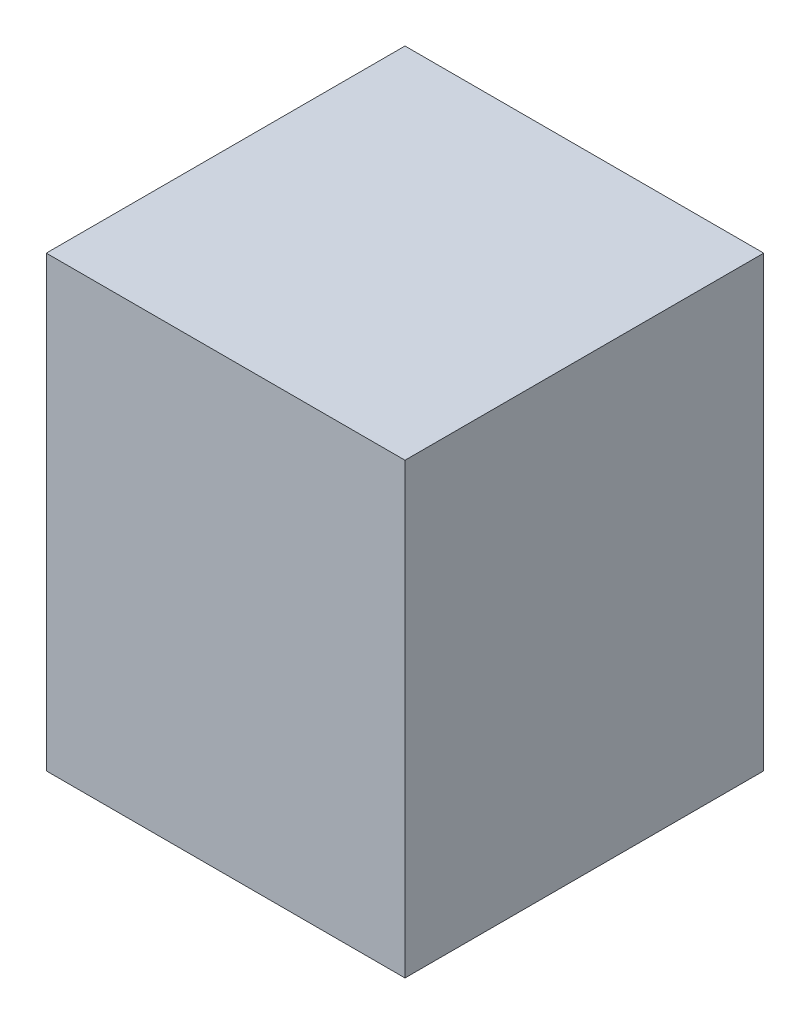
ISO-10303-21;
HEADER;
FILE_DESCRIPTION(('STEP AP214'),'2;1');
FILE_NAME('part.step','',(''),(''),'','','');
FILE_SCHEMA(('AUTOMOTIVE_DESIGN { 1 0 10303 214 1 1 1 1 }'));
ENDSEC;
DATA;
#1=APPLICATION_CONTEXT('core data for automotive mechanical design processes');
#2=APPLICATION_PROTOCOL_DEFINITION('international standard','automotive_design',2000,#1);
#3=PRODUCT_CONTEXT('',#1,'mechanical');
#4=PRODUCT('Part','Part','',(#3));
#5=PRODUCT_RELATED_PRODUCT_CATEGORY('part','',(#4));
#6=PRODUCT_DEFINITION_FORMATION('','',#4);
#7=PRODUCT_DEFINITION_CONTEXT('part definition',#1,'design');
#8=PRODUCT_DEFINITION('design','',#6,#7);
#9=PRODUCT_DEFINITION_SHAPE('','',#8);
#10=(LENGTH_UNIT() NAMED_UNIT(*) SI_UNIT(.MILLI.,.METRE.));
#11=(NAMED_UNIT(*) PLANE_ANGLE_UNIT() SI_UNIT($,.RADIAN.));
#12=(NAMED_UNIT(*) SI_UNIT($,.STERADIAN.) SOLID_ANGLE_UNIT());
#13=UNCERTAINTY_MEASURE_WITH_UNIT(LENGTH_MEASURE(1.E-05),#10,'distance_accuracy_value','');
#14=(GEOMETRIC_REPRESENTATION_CONTEXT(3) GLOBAL_UNCERTAINTY_ASSIGNED_CONTEXT((#13)) GLOBAL_UNIT_ASSIGNED_CONTEXT((#10,
#11,#12)) REPRESENTATION_CONTEXT('',''));
#15=CARTESIAN_POINT('',(0.,0.,0.));
#16=DIRECTION('',(0.,0.,1.));
#17=DIRECTION('',(1.,0.,0.));
#18=AXIS2_PLACEMENT_3D('',#15,#16,#17);
#19=CARTESIAN_POINT('',(0.,100.,0.));
#20=DIRECTION('',(1.,0.,0.));
#21=DIRECTION('',(0.,0.,-1.));
#22=AXIS2_PLACEMENT_3D('',#19,#20,#21);
#23=PLANE('',#22);
#24=DIRECTION('',(0.,0.,1.));
#25=VECTOR('',#24,1.);
#26=CARTESIAN_POINT('',(0.,0.,0.));
#27=LINE('',#26,#25);
#28=CARTESIAN_POINT('',(0.,0.,-80.));
#29=VERTEX_POINT('',#28);
#30=CARTESIAN_POINT('',(0.,0.,0.));
#31=VERTEX_POINT('',#30);
#32=EDGE_CURVE('E95',#29,#31,#27,.T.);
#33=ORIENTED_EDGE('',*,*,#32,.T.);
#34=DIRECTION('',(0.,-1.,0.));
#35=VECTOR('',#34,1.);
#36=CARTESIAN_POINT('',(0.,100.,0.));
#37=LINE('',#36,#35);
#38=CARTESIAN_POINT('',(0.,100.,0.));
#39=VERTEX_POINT('',#38);
#40=EDGE_CURVE('E11',#39,#31,#37,.T.);
#41=ORIENTED_EDGE('',*,*,#40,.F.);
#42=DIRECTION('',(0.,0.,1.));
#43=VECTOR('',#42,1.);
#44=CARTESIAN_POINT('',(0.,100.,0.));
#45=LINE('',#44,#43);
#46=CARTESIAN_POINT('',(0.,100.,-80.));
#47=VERTEX_POINT('',#46);
#48=EDGE_CURVE('E83',#47,#39,#45,.T.);
#49=ORIENTED_EDGE('',*,*,#48,.F.);
#50=DIRECTION('',(0.,-1.,0.));
#51=VECTOR('',#50,1.);
#52=CARTESIAN_POINT('',(0.,100.,-80.));
#53=LINE('',#52,#51);
#54=EDGE_CURVE('E91',#47,#29,#53,.T.);
#55=ORIENTED_EDGE('',*,*,#54,.T.);
#56=EDGE_LOOP('',(#33,#41,#49,#55));
#57=FACE_BOUND('',#56,.T.);
#58=ADVANCED_FACE('F32',(#57),#23,.F.);
#59=CARTESIAN_POINT('',(0.,100.,0.));
#60=DIRECTION('',(0.,0.,-1.));
#61=DIRECTION('',(-1.,0.,0.));
#62=AXIS2_PLACEMENT_3D('',#59,#60,#61);
#63=PLANE('',#62);
#64=DIRECTION('',(1.,0.,0.));
#65=VECTOR('',#64,1.);
#66=CARTESIAN_POINT('',(0.,0.,0.));
#67=LINE('',#66,#65);
#68=CARTESIAN_POINT('',(80.,0.,0.));
#69=VERTEX_POINT('',#68);
#70=EDGE_CURVE('E87',#31,#69,#67,.T.);
#71=ORIENTED_EDGE('',*,*,#70,.T.);
#72=DIRECTION('',(0.,-1.,0.));
#73=VECTOR('',#72,1.);
#74=CARTESIAN_POINT('',(80.,100.,0.));
#75=LINE('',#74,#73);
#76=CARTESIAN_POINT('',(80.,100.,0.));
#77=VERTEX_POINT('',#76);
#78=EDGE_CURVE('E40',#77,#69,#75,.T.);
#79=ORIENTED_EDGE('',*,*,#78,.F.);
#80=DIRECTION('',(1.,0.,0.));
#81=VECTOR('',#80,1.);
#82=CARTESIAN_POINT('',(0.,100.,0.));
#83=LINE('',#82,#81);
#84=EDGE_CURVE('E78',#39,#77,#83,.T.);
#85=ORIENTED_EDGE('',*,*,#84,.F.);
#86=ORIENTED_EDGE('',*,*,#40,.T.);
#87=EDGE_LOOP('',(#71,#79,#85,#86));
#88=FACE_BOUND('',#87,.T.);
#89=ADVANCED_FACE('F86',(#88),#63,.F.);
#90=CARTESIAN_POINT('',(80.,100.,0.));
#91=DIRECTION('',(-1.,0.,0.));
#92=DIRECTION('',(0.,0.,1.));
#93=AXIS2_PLACEMENT_3D('',#90,#91,#92);
#94=PLANE('',#93);
#95=DIRECTION('',(0.,0.,-1.));
#96=VECTOR('',#95,1.);
#97=CARTESIAN_POINT('',(80.,0.,0.));
#98=LINE('',#97,#96);
#99=CARTESIAN_POINT('',(80.,0.,-80.));
#100=VERTEX_POINT('',#99);
#101=EDGE_CURVE('E65',#69,#100,#98,.T.);
#102=ORIENTED_EDGE('',*,*,#101,.T.);
#103=DIRECTION('',(0.,-1.,0.));
#104=VECTOR('',#103,1.);
#105=CARTESIAN_POINT('',(80.,100.,-80.));
#106=LINE('',#105,#104);
#107=CARTESIAN_POINT('',(80.,100.,-80.));
#108=VERTEX_POINT('',#107);
#109=EDGE_CURVE('E88',#108,#100,#106,.T.);
#110=ORIENTED_EDGE('',*,*,#109,.F.);
#111=DIRECTION('',(0.,0.,-1.));
#112=VECTOR('',#111,1.);
#113=CARTESIAN_POINT('',(80.,100.,0.));
#114=LINE('',#113,#112);
#115=EDGE_CURVE('E81',#77,#108,#114,.T.);
#116=ORIENTED_EDGE('',*,*,#115,.F.);
#117=ORIENTED_EDGE('',*,*,#78,.T.);
#118=EDGE_LOOP('',(#102,#110,#116,#117));
#119=FACE_BOUND('',#118,.T.);
#120=ADVANCED_FACE('F89',(#119),#94,.F.);
#121=CARTESIAN_POINT('',(0.,100.,-80.));
#122=DIRECTION('',(0.,0.,1.));
#123=DIRECTION('',(1.,0.,0.));
#124=AXIS2_PLACEMENT_3D('',#121,#122,#123);
#125=PLANE('',#124);
#126=DIRECTION('',(-1.,0.,0.));
#127=VECTOR('',#126,1.);
#128=CARTESIAN_POINT('',(0.,0.,-80.));
#129=LINE('',#128,#127);
#130=EDGE_CURVE('E71',#100,#29,#129,.T.);
#131=ORIENTED_EDGE('',*,*,#130,.T.);
#132=ORIENTED_EDGE('',*,*,#54,.F.);
#133=DIRECTION('',(-1.,0.,0.));
#134=VECTOR('',#133,1.);
#135=CARTESIAN_POINT('',(0.,100.,-80.));
#136=LINE('',#135,#134);
#137=EDGE_CURVE('E48',#108,#47,#136,.T.);
#138=ORIENTED_EDGE('',*,*,#137,.F.);
#139=ORIENTED_EDGE('',*,*,#109,.T.);
#140=EDGE_LOOP('',(#131,#132,#138,#139));
#141=FACE_BOUND('',#140,.T.);
#142=ADVANCED_FACE('F102',(#141),#125,.F.);
#143=CARTESIAN_POINT('',(0.,100.,-80.));
#144=DIRECTION('',(0.,-1.,0.));
#145=DIRECTION('',(0.,0.,-1.));
#146=AXIS2_PLACEMENT_3D('',#143,#144,#145);
#147=PLANE('',#146);
#148=ORIENTED_EDGE('',*,*,#48,.T.);
#149=ORIENTED_EDGE('',*,*,#84,.T.);
#150=ORIENTED_EDGE('',*,*,#115,.T.);
#151=ORIENTED_EDGE('',*,*,#137,.T.);
#152=EDGE_LOOP('',(#148,#149,#150,#151));
#153=FACE_BOUND('',#152,.T.);
#154=ADVANCED_FACE('F79',(#153),#147,.F.);
#155=CARTESIAN_POINT('',(0.,0.,-80.));
#156=DIRECTION('',(0.,-1.,0.));
#157=DIRECTION('',(0.,0.,-1.));
#158=AXIS2_PLACEMENT_3D('',#155,#156,#157);
#159=PLANE('',#158);
#160=ORIENTED_EDGE('',*,*,#32,.F.);
#161=ORIENTED_EDGE('',*,*,#130,.F.);
#162=ORIENTED_EDGE('',*,*,#101,.F.);
#163=ORIENTED_EDGE('',*,*,#70,.F.);
#164=EDGE_LOOP('',(#160,#161,#162,#163));
#165=FACE_BOUND('',#164,.T.);
#166=ADVANCED_FACE('F105',(#165),#159,.T.);
#167=CLOSED_SHELL('',(#58,#89,#120,#142,#154,#166));
#168=MANIFOLD_SOLID_BREP('B2',#167);
#169=ADVANCED_BREP_SHAPE_REPRESENTATION('',(#18,#168),#14);
#170=SHAPE_DEFINITION_REPRESENTATION(#9,#169);
ENDSEC;
END-ISO-10303-21;
